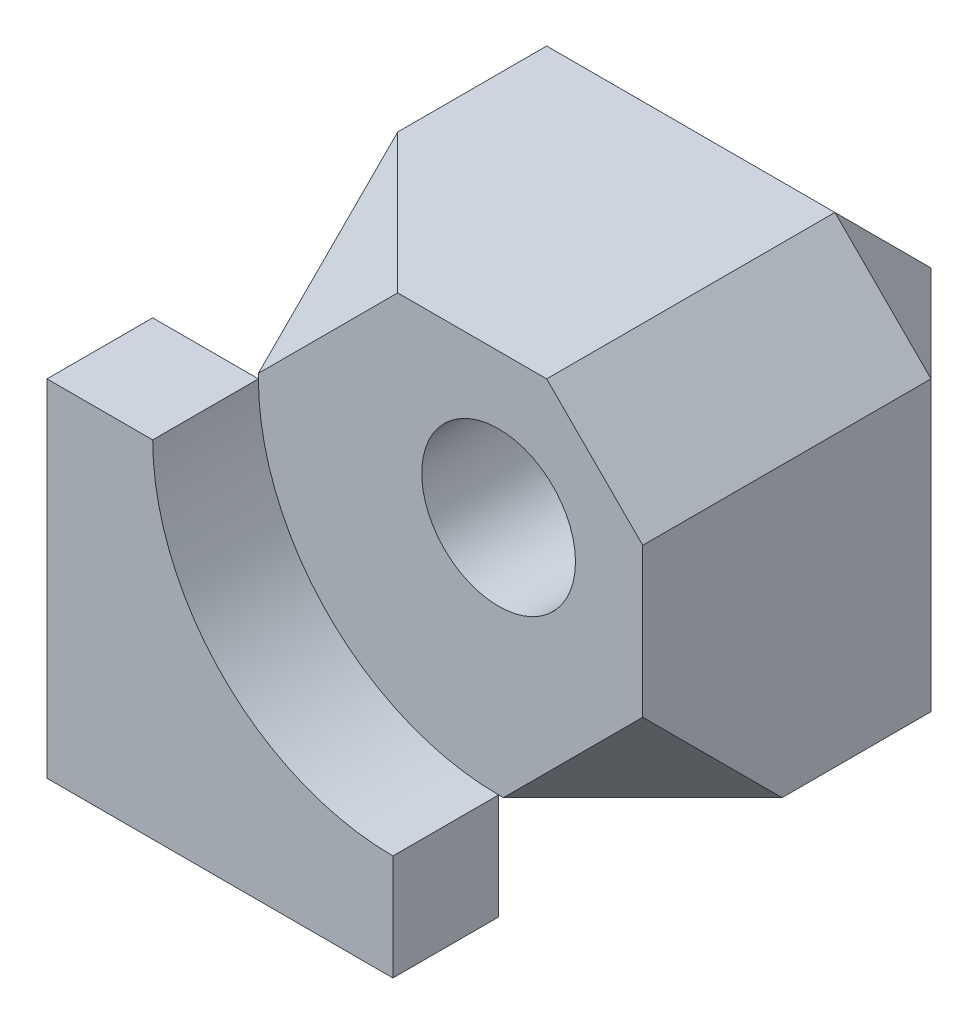
ISO-10303-21;
HEADER;
FILE_DESCRIPTION(('STEP AP214'),'2;1');
FILE_NAME('part.step','',(''),(''),'','','');
FILE_SCHEMA(('AUTOMOTIVE_DESIGN { 1 0 10303 214 1 1 1 1 }'));
ENDSEC;
DATA;
#1=APPLICATION_CONTEXT('core data for automotive mechanical design processes');
#2=APPLICATION_PROTOCOL_DEFINITION('international standard','automotive_design',2000,#1);
#3=PRODUCT_CONTEXT('',#1,'mechanical');
#4=PRODUCT('Part','Part','',(#3));
#5=PRODUCT_RELATED_PRODUCT_CATEGORY('part','',(#4));
#6=PRODUCT_DEFINITION_FORMATION('','',#4);
#7=PRODUCT_DEFINITION_CONTEXT('part definition',#1,'design');
#8=PRODUCT_DEFINITION('design','',#6,#7);
#9=PRODUCT_DEFINITION_SHAPE('','',#8);
#10=(LENGTH_UNIT() NAMED_UNIT(*) SI_UNIT(.MILLI.,.METRE.));
#11=(NAMED_UNIT(*) PLANE_ANGLE_UNIT() SI_UNIT($,.RADIAN.));
#12=(NAMED_UNIT(*) SI_UNIT($,.STERADIAN.) SOLID_ANGLE_UNIT());
#13=UNCERTAINTY_MEASURE_WITH_UNIT(LENGTH_MEASURE(1.E-05),#10,'distance_accuracy_value','');
#14=(GEOMETRIC_REPRESENTATION_CONTEXT(3) GLOBAL_UNCERTAINTY_ASSIGNED_CONTEXT((#13)) GLOBAL_UNIT_ASSIGNED_CONTEXT((#10,
#11,#12)) REPRESENTATION_CONTEXT('',''));
#15=CARTESIAN_POINT('',(0.,0.,0.));
#16=DIRECTION('',(0.,0.,1.));
#17=DIRECTION('',(1.,0.,0.));
#18=AXIS2_PLACEMENT_3D('',#15,#16,#17);
#19=CARTESIAN_POINT('',(0.,-2.50000000000001,7.5));
#20=DIRECTION('',(-1.,0.,0.));
#21=DIRECTION('',(0.,1.,0.));
#22=AXIS2_PLACEMENT_3D('',#19,#20,#21);
#23=PLANE('',#22);
#24=DIRECTION('',(0.,0.,1.));
#25=VECTOR('',#24,1.);
#26=CARTESIAN_POINT('',(0.,-2.20000000000001,7.5));
#27=LINE('',#26,#25);
#28=CARTESIAN_POINT('',(0.,-2.20000000000001,5.00000000000001));
#29=VERTEX_POINT('',#28);
#30=CARTESIAN_POINT('',(0.,-2.20000000000001,7.2));
#31=VERTEX_POINT('',#30);
#32=EDGE_CURVE('E66',#29,#31,#27,.T.);
#33=ORIENTED_EDGE('',*,*,#32,.F.);
#34=DIRECTION('',(0.,1.,0.));
#35=VECTOR('',#34,1.);
#36=CARTESIAN_POINT('',(0.,-2.5,5.00000000000001));
#37=LINE('',#36,#35);
#38=CARTESIAN_POINT('',(0.,0.,5.00000000000001));
#39=VERTEX_POINT('',#38);
#40=EDGE_CURVE('E238',#29,#39,#37,.T.);
#41=ORIENTED_EDGE('',*,*,#40,.T.);
#42=DIRECTION('',(0.,0.,-1.));
#43=VECTOR('',#42,1.);
#44=CARTESIAN_POINT('',(0.,0.,7.5));
#45=LINE('',#44,#43);
#46=CARTESIAN_POINT('',(0.,0.,7.2));
#47=VERTEX_POINT('',#46);
#48=EDGE_CURVE('E212',#47,#39,#45,.T.);
#49=ORIENTED_EDGE('',*,*,#48,.F.);
#50=DIRECTION('',(0.,1.,0.));
#51=VECTOR('',#50,1.);
#52=CARTESIAN_POINT('',(0.,-2.50000000000001,7.2));
#53=LINE('',#52,#51);
#54=EDGE_CURVE('E347',#31,#47,#53,.T.);
#55=ORIENTED_EDGE('',*,*,#54,.F.);
#56=EDGE_LOOP('',(#33,#41,#49,#55));
#57=FACE_BOUND('',#56,.T.);
#58=ADVANCED_FACE('F50',(#57),#23,.F.);
#59=CARTESIAN_POINT('',(-7.20000000000001,0.,0.));
#60=DIRECTION('',(-1.,0.,0.));
#61=DIRECTION('',(0.,-1.,0.));
#62=AXIS2_PLACEMENT_3D('',#59,#60,#61);
#63=PLANE('',#62);
#64=DIRECTION('',(0.,-1.,0.));
#65=VECTOR('',#64,1.);
#66=CARTESIAN_POINT('',(-7.20000000000001,-2.5,0.));
#67=LINE('',#66,#65);
#68=CARTESIAN_POINT('',(-7.20000000000001,0.,0.));
#69=VERTEX_POINT('',#68);
#70=CARTESIAN_POINT('',(-7.20000000000001,-2.20000000000001,0.));
#71=VERTEX_POINT('',#70);
#72=EDGE_CURVE('E165',#69,#71,#67,.T.);
#73=ORIENTED_EDGE('',*,*,#72,.T.);
#74=DIRECTION('',(0.,0.,1.));
#75=VECTOR('',#74,1.);
#76=CARTESIAN_POINT('',(-7.20000000000001,-2.20000000000001,0.));
#77=LINE('',#76,#75);
#78=CARTESIAN_POINT('',(-7.20000000000001,-2.20000000000001,7.2));
#79=VERTEX_POINT('',#78);
#80=EDGE_CURVE('E158',#71,#79,#77,.T.);
#81=ORIENTED_EDGE('',*,*,#80,.T.);
#82=DIRECTION('',(0.,1.,0.));
#83=VECTOR('',#82,1.);
#84=CARTESIAN_POINT('',(-7.20000000000001,0.,7.2));
#85=LINE('',#84,#83);
#86=CARTESIAN_POINT('',(-7.20000000000001,4.99999999999999,7.2));
#87=VERTEX_POINT('',#86);
#88=EDGE_CURVE('E59',#79,#87,#85,.T.);
#89=ORIENTED_EDGE('',*,*,#88,.T.);
#90=DIRECTION('',(0.,0.,-1.));
#91=VECTOR('',#90,1.);
#92=CARTESIAN_POINT('',(-7.20000000000001,4.99999999999999,7.5));
#93=LINE('',#92,#91);
#94=CARTESIAN_POINT('',(-7.20000000000001,5.,5.));
#95=VERTEX_POINT('',#94);
#96=EDGE_CURVE('E259',#87,#95,#93,.T.);
#97=ORIENTED_EDGE('',*,*,#96,.T.);
#98=CARTESIAN_POINT('',(-7.20000000000001,5.00000000000001,0.));
#99=DIRECTION('',(-1.,0.,0.));
#100=DIRECTION('',(0.,-1.,0.));
#101=AXIS2_PLACEMENT_3D('',#98,#99,#100);
#102=CIRCLE('',#101,5.00000000000001);
#103=EDGE_CURVE('E173',#95,#69,#102,.F.);
#104=ORIENTED_EDGE('',*,*,#103,.T.);
#105=EDGE_LOOP('',(#73,#81,#89,#97,#104));
#106=FACE_BOUND('',#105,.T.);
#107=ADVANCED_FACE('F163',(#106),#63,.T.);
#108=CARTESIAN_POINT('',(-7.5,-2.5,0.));
#109=DIRECTION('',(0.,0.,1.));
#110=DIRECTION('',(0.,-1.,0.));
#111=AXIS2_PLACEMENT_3D('',#108,#109,#110);
#112=PLANE('',#111);
#113=DIRECTION('',(1.,0.,0.));
#114=VECTOR('',#113,1.);
#115=CARTESIAN_POINT('',(-7.5,-2.20000000000001,0.));
#116=LINE('',#115,#114);
#117=CARTESIAN_POINT('',(-5.00000000000001,-2.20000000000001,0.));
#118=VERTEX_POINT('',#117);
#119=EDGE_CURVE('E355',#71,#118,#116,.T.);
#120=ORIENTED_EDGE('',*,*,#119,.F.);
#121=ORIENTED_EDGE('',*,*,#72,.F.);
#122=DIRECTION('',(1.,0.,0.));
#123=VECTOR('',#122,1.);
#124=CARTESIAN_POINT('',(-7.5,0.,0.));
#125=LINE('',#124,#123);
#126=CARTESIAN_POINT('',(-5.,0.,0.));
#127=VERTEX_POINT('',#126);
#128=EDGE_CURVE('E227',#69,#127,#125,.T.);
#129=ORIENTED_EDGE('',*,*,#128,.T.);
#130=DIRECTION('',(0.,-1.,0.));
#131=VECTOR('',#130,1.);
#132=CARTESIAN_POINT('',(-5.,-2.5,0.));
#133=LINE('',#132,#131);
#134=EDGE_CURVE('E234',#127,#118,#133,.T.);
#135=ORIENTED_EDGE('',*,*,#134,.T.);
#136=EDGE_LOOP('',(#120,#121,#129,#135));
#137=FACE_BOUND('',#136,.T.);
#138=ADVANCED_FACE('F423',(#137),#112,.F.);
#139=CARTESIAN_POINT('',(0.,-2.5,0.));
#140=DIRECTION('',(0.,1.,0.));
#141=DIRECTION('',(1.,0.,0.));
#142=AXIS2_PLACEMENT_3D('',#139,#140,#141);
#143=CYLINDRICAL_SURFACE('',#142,5.00000000000001);
#144=CARTESIAN_POINT('',(0.,-2.20000000000001,0.));
#145=DIRECTION('',(0.,-1.,0.));
#146=DIRECTION('',(1.,0.,0.));
#147=AXIS2_PLACEMENT_3D('',#144,#145,#146);
#148=CIRCLE('',#147,5.00000000000001);
#149=EDGE_CURVE('E358',#118,#29,#148,.F.);
#150=ORIENTED_EDGE('',*,*,#149,.F.);
#151=ORIENTED_EDGE('',*,*,#134,.F.);
#152=CARTESIAN_POINT('',(0.,0.,0.));
#153=DIRECTION('',(0.,1.,0.));
#154=DIRECTION('',(1.,0.,0.));
#155=AXIS2_PLACEMENT_3D('',#152,#153,#154);
#156=CIRCLE('',#155,5.00000000000001);
#157=EDGE_CURVE('E241',#127,#39,#156,.T.);
#158=ORIENTED_EDGE('',*,*,#157,.T.);
#159=ORIENTED_EDGE('',*,*,#40,.F.);
#160=EDGE_LOOP('',(#150,#151,#158,#159));
#161=FACE_BOUND('',#160,.T.);
#162=ADVANCED_FACE('F368',(#161),#143,.F.);
#163=CARTESIAN_POINT('',(0.,0.,7.2));
#164=DIRECTION('',(0.,0.,1.));
#165=DIRECTION('',(1.,0.,0.));
#166=AXIS2_PLACEMENT_3D('',#163,#164,#165);
#167=PLANE('',#166);
#168=ORIENTED_EDGE('',*,*,#88,.F.);
#169=DIRECTION('',(1.,0.,0.));
#170=VECTOR('',#169,1.);
#171=CARTESIAN_POINT('',(0.,-2.20000000000001,7.2));
#172=LINE('',#171,#170);
#173=EDGE_CURVE('E11',#79,#31,#172,.T.);
#174=ORIENTED_EDGE('',*,*,#173,.T.);
#175=ORIENTED_EDGE('',*,*,#54,.T.);
#176=CARTESIAN_POINT('',(0.,5.,7.2));
#177=DIRECTION('',(0.,0.,1.));
#178=DIRECTION('',(1.,0.,0.));
#179=AXIS2_PLACEMENT_3D('',#176,#177,#178);
#180=CIRCLE('',#179,5.00000000000001);
#181=CARTESIAN_POINT('',(-5.00000000000001,4.99999999999999,7.2));
#182=VERTEX_POINT('',#181);
#183=EDGE_CURVE('E350',#47,#182,#180,.F.);
#184=ORIENTED_EDGE('',*,*,#183,.T.);
#185=DIRECTION('',(-1.,0.,0.));
#186=VECTOR('',#185,1.);
#187=CARTESIAN_POINT('',(-7.50000000000001,4.99999999999999,7.2));
#188=LINE('',#187,#186);
#189=EDGE_CURVE('E170',#182,#87,#188,.T.);
#190=ORIENTED_EDGE('',*,*,#189,.T.);
#191=EDGE_LOOP('',(#168,#174,#175,#184,#190));
#192=FACE_BOUND('',#191,.T.);
#193=ADVANCED_FACE('F168',(#192),#167,.T.);
#194=CARTESIAN_POINT('',(-7.50000000000001,4.99999999999999,7.5));
#195=DIRECTION('',(0.,-1.,0.));
#196=DIRECTION('',(-1.,0.,0.));
#197=AXIS2_PLACEMENT_3D('',#194,#195,#196);
#198=PLANE('',#197);
#199=ORIENTED_EDGE('',*,*,#189,.F.);
#200=DIRECTION('',(0.,0.,-1.));
#201=VECTOR('',#200,1.);
#202=CARTESIAN_POINT('',(-5.00000000000001,4.99999999999999,7.5));
#203=LINE('',#202,#201);
#204=CARTESIAN_POINT('',(-5.00000000000001,4.99999999999999,5.));
#205=VERTEX_POINT('',#204);
#206=EDGE_CURVE('E216',#182,#205,#203,.T.);
#207=ORIENTED_EDGE('',*,*,#206,.T.);
#208=DIRECTION('',(1.,0.,0.));
#209=VECTOR('',#208,1.);
#210=CARTESIAN_POINT('',(-7.5,5.,5.));
#211=LINE('',#210,#209);
#212=EDGE_CURVE('E223',#95,#205,#211,.T.);
#213=ORIENTED_EDGE('',*,*,#212,.F.);
#214=ORIENTED_EDGE('',*,*,#96,.F.);
#215=EDGE_LOOP('',(#199,#207,#213,#214));
#216=FACE_BOUND('',#215,.T.);
#217=ADVANCED_FACE('F52',(#216),#198,.F.);
#218=CARTESIAN_POINT('',(0.,5.,7.5));
#219=DIRECTION('',(0.,0.,-1.));
#220=DIRECTION('',(0.,1.,0.));
#221=AXIS2_PLACEMENT_3D('',#218,#219,#220);
#222=CYLINDRICAL_SURFACE('',#221,5.00000000000001);
#223=ORIENTED_EDGE('',*,*,#183,.F.);
#224=ORIENTED_EDGE('',*,*,#48,.T.);
#225=CARTESIAN_POINT('',(0.,5.,5.));
#226=DIRECTION('',(0.,0.,-1.));
#227=DIRECTION('',(0.,1.,0.));
#228=AXIS2_PLACEMENT_3D('',#225,#226,#227);
#229=CIRCLE('',#228,5.00000000000001);
#230=EDGE_CURVE('E219',#39,#205,#229,.T.);
#231=ORIENTED_EDGE('',*,*,#230,.T.);
#232=ORIENTED_EDGE('',*,*,#206,.F.);
#233=EDGE_LOOP('',(#223,#224,#231,#232));
#234=FACE_BOUND('',#233,.T.);
#235=ADVANCED_FACE('F417',(#234),#222,.F.);
#236=CARTESIAN_POINT('',(-7.5,5.00000000000001,0.));
#237=DIRECTION('',(1.,0.,0.));
#238=DIRECTION('',(0.,0.,-1.));
#239=AXIS2_PLACEMENT_3D('',#236,#237,#238);
#240=CYLINDRICAL_SURFACE('',#239,5.00000000000001);
#241=ORIENTED_EDGE('',*,*,#103,.F.);
#242=ORIENTED_EDGE('',*,*,#212,.T.);
#243=CARTESIAN_POINT('',(-5.,5.00000000000001,0.));
#244=DIRECTION('',(1.,0.,0.));
#245=DIRECTION('',(0.,0.,-1.));
#246=AXIS2_PLACEMENT_3D('',#243,#244,#245);
#247=CIRCLE('',#246,5.00000000000001);
#248=EDGE_CURVE('E230',#205,#127,#247,.T.);
#249=ORIENTED_EDGE('',*,*,#248,.T.);
#250=ORIENTED_EDGE('',*,*,#128,.F.);
#251=EDGE_LOOP('',(#241,#242,#249,#250));
#252=FACE_BOUND('',#251,.T.);
#253=ADVANCED_FACE('F421',(#252),#240,.F.);
#254=CARTESIAN_POINT('',(0.,0.,0.));
#255=DIRECTION('',(0.,-1.,0.));
#256=DIRECTION('',(0.,0.,-1.));
#257=AXIS2_PLACEMENT_3D('',#254,#255,#256);
#258=PLANE('',#257);
#259=CARTESIAN_POINT('',(0.,0.,0.));
#260=DIRECTION('',(0.,-1.,0.));
#261=DIRECTION('',(0.,0.,-1.));
#262=AXIS2_PLACEMENT_3D('',#259,#260,#261);
#263=CIRCLE('',#262,1.6);
#264=CARTESIAN_POINT('',(0.,0.,-1.6));
#265=VERTEX_POINT('',#264);
#266=EDGE_CURVE('E309',#265,#265,#263,.T.);
#267=ORIENTED_EDGE('',*,*,#266,.F.);
#268=EDGE_LOOP('',(#267));
#269=FACE_BOUND('',#268,.T.);
#270=DIRECTION('',(0.,0.,1.));
#271=VECTOR('',#270,1.);
#272=CARTESIAN_POINT('',(-5.,0.,5.));
#273=LINE('',#272,#271);
#274=CARTESIAN_POINT('',(-5.,0.,-0.100000000000001));
#275=VERTEX_POINT('',#274);
#276=EDGE_CURVE('E296',#275,#127,#273,.T.);
#277=ORIENTED_EDGE('',*,*,#276,.F.);
#278=DIRECTION('',(0.707106781186548,0.,-0.707106781186548));
#279=VECTOR('',#278,1.);
#280=CARTESIAN_POINT('',(-2.55,0.,-2.55));
#281=LINE('',#280,#279);
#282=CARTESIAN_POINT('',(-2.10000000000001,0.,-3.));
#283=VERTEX_POINT('',#282);
#284=EDGE_CURVE('E185',#275,#283,#281,.T.);
#285=ORIENTED_EDGE('',*,*,#284,.T.);
#286=DIRECTION('',(-1.,0.,0.));
#287=VECTOR('',#286,1.);
#288=CARTESIAN_POINT('',(19.142135623731,0.,-3.));
#289=LINE('',#288,#287);
#290=CARTESIAN_POINT('',(0.999999999999994,0.,-3.));
#291=VERTEX_POINT('',#290);
#292=EDGE_CURVE('E325',#291,#283,#289,.T.);
#293=ORIENTED_EDGE('',*,*,#292,.F.);
#294=DIRECTION('',(-0.707106781186549,0.,-0.707106781186546));
#295=VECTOR('',#294,1.);
#296=CARTESIAN_POINT('',(2.,0.,-2.));
#297=LINE('',#296,#295);
#298=CARTESIAN_POINT('',(3.,0.,-1.));
#299=VERTEX_POINT('',#298);
#300=EDGE_CURVE('E262',#291,#299,#297,.F.);
#301=ORIENTED_EDGE('',*,*,#300,.T.);
#302=DIRECTION('',(0.,0.,1.));
#303=VECTOR('',#302,1.);
#304=CARTESIAN_POINT('',(3.,0.,-11.2462112512353));
#305=LINE('',#304,#303);
#306=CARTESIAN_POINT('',(3.,0.,2.1));
#307=VERTEX_POINT('',#306);
#308=EDGE_CURVE('E337',#299,#307,#305,.T.);
#309=ORIENTED_EDGE('',*,*,#308,.T.);
#310=DIRECTION('',(-0.707106781186547,0.,0.707106781186547));
#311=VECTOR('',#310,1.);
#312=CARTESIAN_POINT('',(2.55,0.,2.55));
#313=LINE('',#312,#311);
#314=CARTESIAN_POINT('',(0.100000000000001,0.,5.));
#315=VERTEX_POINT('',#314);
#316=EDGE_CURVE('E197',#307,#315,#313,.T.);
#317=ORIENTED_EDGE('',*,*,#316,.T.);
#318=DIRECTION('',(1.,0.,0.));
#319=VECTOR('',#318,1.);
#320=CARTESIAN_POINT('',(-5.,0.,5.));
#321=LINE('',#320,#319);
#322=EDGE_CURVE('E292',#39,#315,#321,.T.);
#323=ORIENTED_EDGE('',*,*,#322,.F.);
#324=ORIENTED_EDGE('',*,*,#157,.F.);
#325=EDGE_LOOP('',(#277,#285,#293,#301,#309,#317,#323,#324));
#326=FACE_BOUND('',#325,.T.);
#327=ADVANCED_FACE('F373',(#269,#326),#258,.T.);
#328=CARTESIAN_POINT('',(-5.,10.,5.));
#329=DIRECTION('',(1.,0.,0.));
#330=DIRECTION('',(0.,0.,-1.));
#331=AXIS2_PLACEMENT_3D('',#328,#329,#330);
#332=PLANE('',#331);
#333=DIRECTION('',(0.,0.707106781186548,-0.707106781186547));
#334=VECTOR('',#333,1.);
#335=CARTESIAN_POINT('',(-5.,2.45,-2.55));
#336=LINE('',#335,#334);
#337=CARTESIAN_POINT('',(-5.,2.89999999999999,-3.));
#338=VERTEX_POINT('',#337);
#339=EDGE_CURVE('E181',#275,#338,#336,.T.);
#340=ORIENTED_EDGE('',*,*,#339,.F.);
#341=ORIENTED_EDGE('',*,*,#276,.T.);
#342=ORIENTED_EDGE('',*,*,#248,.F.);
#343=DIRECTION('',(0.,-1.,0.));
#344=VECTOR('',#343,1.);
#345=CARTESIAN_POINT('',(-5.,10.,5.));
#346=LINE('',#345,#344);
#347=CARTESIAN_POINT('',(-5.,5.1,5.));
#348=VERTEX_POINT('',#347);
#349=EDGE_CURVE('E288',#348,#205,#346,.T.);
#350=ORIENTED_EDGE('',*,*,#349,.F.);
#351=DIRECTION('',(0.,-0.707106781186547,0.707106781186548));
#352=VECTOR('',#351,1.);
#353=CARTESIAN_POINT('',(-5.,7.55,2.55));
#354=LINE('',#353,#352);
#355=CARTESIAN_POINT('',(-5.,8.,2.09999999999999));
#356=VERTEX_POINT('',#355);
#357=EDGE_CURVE('E208',#356,#348,#354,.T.);
#358=ORIENTED_EDGE('',*,*,#357,.F.);
#359=DIRECTION('',(0.,0.,1.));
#360=VECTOR('',#359,1.);
#361=CARTESIAN_POINT('',(-5.,8.,5.));
#362=LINE('',#361,#360);
#363=CARTESIAN_POINT('',(-5.,8.,-0.999999999999993));
#364=VERTEX_POINT('',#363);
#365=EDGE_CURVE('E328',#364,#356,#362,.T.);
#366=ORIENTED_EDGE('',*,*,#365,.F.);
#367=DIRECTION('',(0.,0.707106781186546,0.707106781186549));
#368=VECTOR('',#367,1.);
#369=CARTESIAN_POINT('',(-5.,8.,-0.999999999999993));
#370=LINE('',#369,#368);
#371=CARTESIAN_POINT('',(-5.,6.,-3.));
#372=VERTEX_POINT('',#371);
#373=EDGE_CURVE('E277',#364,#372,#370,.F.);
#374=ORIENTED_EDGE('',*,*,#373,.T.);
#375=DIRECTION('',(0.,1.,0.));
#376=VECTOR('',#375,1.);
#377=CARTESIAN_POINT('',(-5.,8.,-3.));
#378=LINE('',#377,#376);
#379=EDGE_CURVE('E334',#338,#372,#378,.T.);
#380=ORIENTED_EDGE('',*,*,#379,.F.);
#381=EDGE_LOOP('',(#340,#341,#342,#350,#358,#366,#374,#380));
#382=FACE_BOUND('',#381,.T.);
#383=CARTESIAN_POINT('',(-5.,5.,0.));
#384=DIRECTION('',(1.,0.,0.));
#385=DIRECTION('',(0.,0.,-1.));
#386=AXIS2_PLACEMENT_3D('',#383,#384,#385);
#387=CIRCLE('',#386,1.6);
#388=CARTESIAN_POINT('',(-5.,5.,-1.6));
#389=VERTEX_POINT('',#388);
#390=EDGE_CURVE('E317',#389,#389,#387,.T.);
#391=ORIENTED_EDGE('',*,*,#390,.T.);
#392=EDGE_LOOP('',(#391));
#393=FACE_BOUND('',#392,.T.);
#394=ADVANCED_FACE('F410',(#382,#393),#332,.F.);
#395=CARTESIAN_POINT('',(-5.,10.,5.));
#396=DIRECTION('',(0.,0.,-1.));
#397=DIRECTION('',(-1.,0.,0.));
#398=AXIS2_PLACEMENT_3D('',#395,#396,#397);
#399=PLANE('',#398);
#400=DIRECTION('',(-0.707106781186547,-0.707106781186547,0.));
#401=VECTOR('',#400,1.);
#402=CARTESIAN_POINT('',(2.55,2.45,5.));
#403=LINE('',#402,#401);
#404=CARTESIAN_POINT('',(3.,2.9,5.));
#405=VERTEX_POINT('',#404);
#406=EDGE_CURVE('E193',#405,#315,#403,.T.);
#407=ORIENTED_EDGE('',*,*,#406,.F.);
#408=DIRECTION('',(0.,-1.,0.));
#409=VECTOR('',#408,1.);
#410=CARTESIAN_POINT('',(3.,8.,5.));
#411=LINE('',#410,#409);
#412=CARTESIAN_POINT('',(3.,6.,5.));
#413=VERTEX_POINT('',#412);
#414=EDGE_CURVE('E250',#413,#405,#411,.T.);
#415=ORIENTED_EDGE('',*,*,#414,.F.);
#416=DIRECTION('',(0.707106781186549,-0.707106781186546,0.));
#417=VECTOR('',#416,1.);
#418=CARTESIAN_POINT('',(3.,6.,5.));
#419=LINE('',#418,#417);
#420=CARTESIAN_POINT('',(0.999999999999994,8.,5.));
#421=VERTEX_POINT('',#420);
#422=EDGE_CURVE('E245',#413,#421,#419,.F.);
#423=ORIENTED_EDGE('',*,*,#422,.T.);
#424=DIRECTION('',(-1.,0.,0.));
#425=VECTOR('',#424,1.);
#426=CARTESIAN_POINT('',(19.142135623731,8.,5.));
#427=LINE('',#426,#425);
#428=CARTESIAN_POINT('',(-2.09999999999999,8.,5.));
#429=VERTEX_POINT('',#428);
#430=EDGE_CURVE('E321',#421,#429,#427,.T.);
#431=ORIENTED_EDGE('',*,*,#430,.T.);
#432=DIRECTION('',(0.707106781186548,0.707106781186547,0.));
#433=VECTOR('',#432,1.);
#434=CARTESIAN_POINT('',(-2.55,7.55,5.));
#435=LINE('',#434,#433);
#436=EDGE_CURVE('E204',#348,#429,#435,.T.);
#437=ORIENTED_EDGE('',*,*,#436,.F.);
#438=ORIENTED_EDGE('',*,*,#349,.T.);
#439=ORIENTED_EDGE('',*,*,#230,.F.);
#440=ORIENTED_EDGE('',*,*,#322,.T.);
#441=EDGE_LOOP('',(#407,#415,#423,#431,#437,#438,#439,#440));
#442=FACE_BOUND('',#441,.T.);
#443=CARTESIAN_POINT('',(0.,5.,5.));
#444=DIRECTION('',(0.,0.,1.));
#445=DIRECTION('',(1.,0.,0.));
#446=AXIS2_PLACEMENT_3D('',#443,#444,#445);
#447=CIRCLE('',#446,1.6);
#448=CARTESIAN_POINT('',(1.6,5.,5.));
#449=VERTEX_POINT('',#448);
#450=EDGE_CURVE('E301',#449,#449,#447,.T.);
#451=ORIENTED_EDGE('',*,*,#450,.F.);
#452=EDGE_LOOP('',(#451));
#453=FACE_BOUND('',#452,.T.);
#454=ADVANCED_FACE('F378',(#442,#453),#399,.F.);
#455=CARTESIAN_POINT('',(0.,5.,1.8));
#456=DIRECTION('',(0.,0.,1.));
#457=DIRECTION('',(1.,0.,0.));
#458=AXIS2_PLACEMENT_3D('',#455,#456,#457);
#459=CYLINDRICAL_SURFACE('',#458,1.6);
#460=CARTESIAN_POINT('',(0.,5.,1.8));
#461=DIRECTION('',(0.,0.,1.));
#462=DIRECTION('',(1.,0.,0.));
#463=AXIS2_PLACEMENT_3D('',#460,#461,#462);
#464=CIRCLE('',#463,1.6);
#465=CARTESIAN_POINT('',(1.6,5.,1.8));
#466=VERTEX_POINT('',#465);
#467=EDGE_CURVE('E300',#466,#466,#464,.T.);
#468=ORIENTED_EDGE('',*,*,#467,.F.);
#469=EDGE_LOOP('',(#468));
#470=FACE_BOUND('',#469,.T.);
#471=ORIENTED_EDGE('',*,*,#450,.T.);
#472=EDGE_LOOP('',(#471));
#473=FACE_BOUND('',#472,.T.);
#474=ADVANCED_FACE('F487',(#470,#473),#459,.F.);
#475=CARTESIAN_POINT('',(0.,5.,1.8));
#476=DIRECTION('',(0.,0.,1.));
#477=DIRECTION('',(1.,0.,0.));
#478=AXIS2_PLACEMENT_3D('',#475,#476,#477);
#479=PLANE('',#478);
#480=ORIENTED_EDGE('',*,*,#467,.T.);
#481=EDGE_LOOP('',(#480));
#482=FACE_BOUND('',#481,.T.);
#483=ADVANCED_FACE('F483',(#482),#479,.T.);
#484=CARTESIAN_POINT('',(0.,3.2,0.));
#485=DIRECTION('',(0.,-1.,0.));
#486=DIRECTION('',(0.,0.,-1.));
#487=AXIS2_PLACEMENT_3D('',#484,#485,#486);
#488=CYLINDRICAL_SURFACE('',#487,1.6);
#489=CARTESIAN_POINT('',(0.,3.2,0.));
#490=DIRECTION('',(0.,-1.,0.));
#491=DIRECTION('',(0.,0.,-1.));
#492=AXIS2_PLACEMENT_3D('',#489,#490,#491);
#493=CIRCLE('',#492,1.6);
#494=CARTESIAN_POINT('',(0.,3.2,-1.6));
#495=VERTEX_POINT('',#494);
#496=EDGE_CURVE('E305',#495,#495,#493,.T.);
#497=ORIENTED_EDGE('',*,*,#496,.F.);
#498=EDGE_LOOP('',(#497));
#499=FACE_BOUND('',#498,.T.);
#500=ORIENTED_EDGE('',*,*,#266,.T.);
#501=EDGE_LOOP('',(#500));
#502=FACE_BOUND('',#501,.T.);
#503=ADVANCED_FACE('F479',(#499,#502),#488,.F.);
#504=CARTESIAN_POINT('',(0.,3.2,0.));
#505=DIRECTION('',(0.,-1.,0.));
#506=DIRECTION('',(0.,0.,-1.));
#507=AXIS2_PLACEMENT_3D('',#504,#505,#506);
#508=PLANE('',#507);
#509=ORIENTED_EDGE('',*,*,#496,.T.);
#510=EDGE_LOOP('',(#509));
#511=FACE_BOUND('',#510,.T.);
#512=ADVANCED_FACE('F475',(#511),#508,.T.);
#513=CARTESIAN_POINT('',(-1.8,5.,0.));
#514=DIRECTION('',(-1.,0.,0.));
#515=DIRECTION('',(0.,0.,1.));
#516=AXIS2_PLACEMENT_3D('',#513,#514,#515);
#517=CYLINDRICAL_SURFACE('',#516,1.6);
#518=CARTESIAN_POINT('',(-1.8,5.,0.));
#519=DIRECTION('',(1.,0.,0.));
#520=DIRECTION('',(0.,0.,-1.));
#521=AXIS2_PLACEMENT_3D('',#518,#519,#520);
#522=CIRCLE('',#521,1.6);
#523=CARTESIAN_POINT('',(-1.8,5.,-1.6));
#524=VERTEX_POINT('',#523);
#525=EDGE_CURVE('E313',#524,#524,#522,.T.);
#526=ORIENTED_EDGE('',*,*,#525,.T.);
#527=EDGE_LOOP('',(#526));
#528=FACE_BOUND('',#527,.T.);
#529=ORIENTED_EDGE('',*,*,#390,.F.);
#530=EDGE_LOOP('',(#529));
#531=FACE_BOUND('',#530,.T.);
#532=ADVANCED_FACE('F471',(#528,#531),#517,.F.);
#533=CARTESIAN_POINT('',(-1.8,5.,0.));
#534=DIRECTION('',(1.,0.,0.));
#535=DIRECTION('',(0.,0.,-1.));
#536=AXIS2_PLACEMENT_3D('',#533,#534,#535);
#537=PLANE('',#536);
#538=ORIENTED_EDGE('',*,*,#525,.F.);
#539=EDGE_LOOP('',(#538));
#540=FACE_BOUND('',#539,.T.);
#541=ADVANCED_FACE('F465',(#540),#537,.F.);
#542=CARTESIAN_POINT('',(19.142135623731,8.,5.));
#543=DIRECTION('',(0.,-1.,0.));
#544=DIRECTION('',(0.,0.,-1.));
#545=AXIS2_PLACEMENT_3D('',#542,#543,#544);
#546=PLANE('',#545);
#547=DIRECTION('',(-0.707106781186548,0.,-0.707106781186547));
#548=VECTOR('',#547,1.);
#549=CARTESIAN_POINT('',(8.52106781186548,8.,15.6210678118655));
#550=LINE('',#549,#548);
#551=EDGE_CURVE('E200',#429,#356,#550,.T.);
#552=ORIENTED_EDGE('',*,*,#551,.F.);
#553=ORIENTED_EDGE('',*,*,#430,.F.);
#554=DIRECTION('',(0.,0.,-1.));
#555=VECTOR('',#554,1.);
#556=CARTESIAN_POINT('',(0.999999999999994,8.,5.));
#557=LINE('',#556,#555);
#558=CARTESIAN_POINT('',(0.999999999999994,8.,-0.999999999999993));
#559=VERTEX_POINT('',#558);
#560=EDGE_CURVE('E285',#421,#559,#557,.T.);
#561=ORIENTED_EDGE('',*,*,#560,.T.);
#562=DIRECTION('',(-1.,0.,0.));
#563=VECTOR('',#562,1.);
#564=CARTESIAN_POINT('',(19.142135623731,8.,-0.999999999999993));
#565=LINE('',#564,#563);
#566=EDGE_CURVE('E281',#559,#364,#565,.T.);
#567=ORIENTED_EDGE('',*,*,#566,.T.);
#568=ORIENTED_EDGE('',*,*,#365,.T.);
#569=EDGE_LOOP('',(#552,#553,#561,#567,#568));
#570=FACE_BOUND('',#569,.T.);
#571=ADVANCED_FACE('F402',(#570),#546,.F.);
#572=CARTESIAN_POINT('',(19.142135623731,8.,-3.));
#573=DIRECTION('',(0.,0.,1.));
#574=DIRECTION('',(1.,0.,0.));
#575=AXIS2_PLACEMENT_3D('',#572,#573,#574);
#576=PLANE('',#575);
#577=DIRECTION('',(0.707106781186547,-0.707106781186548,0.));
#578=VECTOR('',#577,1.);
#579=CARTESIAN_POINT('',(4.52106781186547,-6.62106781186548,-3.));
#580=LINE('',#579,#578);
#581=EDGE_CURVE('E175',#338,#283,#580,.T.);
#582=ORIENTED_EDGE('',*,*,#581,.F.);
#583=ORIENTED_EDGE('',*,*,#379,.T.);
#584=DIRECTION('',(1.,0.,0.));
#585=VECTOR('',#584,1.);
#586=CARTESIAN_POINT('',(19.142135623731,6.,-3.));
#587=LINE('',#586,#585);
#588=CARTESIAN_POINT('',(0.999999999999994,6.,-3.));
#589=VERTEX_POINT('',#588);
#590=EDGE_CURVE('E271',#372,#589,#587,.T.);
#591=ORIENTED_EDGE('',*,*,#590,.T.);
#592=DIRECTION('',(0.,-1.,0.));
#593=VECTOR('',#592,1.);
#594=CARTESIAN_POINT('',(0.999999999999994,8.,-3.));
#595=LINE('',#594,#593);
#596=EDGE_CURVE('E274',#589,#291,#595,.T.);
#597=ORIENTED_EDGE('',*,*,#596,.T.);
#598=ORIENTED_EDGE('',*,*,#292,.T.);
#599=EDGE_LOOP('',(#582,#583,#591,#597,#598));
#600=FACE_BOUND('',#599,.T.);
#601=ADVANCED_FACE('F462',(#600),#576,.F.);
#602=CARTESIAN_POINT('',(3.,8.,-11.2462112512353));
#603=DIRECTION('',(-1.,0.,0.));
#604=DIRECTION('',(0.,-1.,0.));
#605=AXIS2_PLACEMENT_3D('',#602,#603,#604);
#606=PLANE('',#605);
#607=DIRECTION('',(0.,0.707106781186547,0.707106781186548));
#608=VECTOR('',#607,1.);
#609=CARTESIAN_POINT('',(3.,-2.67310562561766,-0.573105625617661));
#610=LINE('',#609,#608);
#611=EDGE_CURVE('E189',#307,#405,#610,.T.);
#612=ORIENTED_EDGE('',*,*,#611,.F.);
#613=ORIENTED_EDGE('',*,*,#308,.F.);
#614=DIRECTION('',(0.,1.,0.));
#615=VECTOR('',#614,1.);
#616=CARTESIAN_POINT('',(3.,8.,-1.));
#617=LINE('',#616,#615);
#618=CARTESIAN_POINT('',(3.,6.,-1.));
#619=VERTEX_POINT('',#618);
#620=EDGE_CURVE('E265',#299,#619,#617,.T.);
#621=ORIENTED_EDGE('',*,*,#620,.T.);
#622=DIRECTION('',(0.,0.,1.));
#623=VECTOR('',#622,1.);
#624=CARTESIAN_POINT('',(3.,6.,-11.2462112512353));
#625=LINE('',#624,#623);
#626=EDGE_CURVE('E268',#619,#413,#625,.T.);
#627=ORIENTED_EDGE('',*,*,#626,.T.);
#628=ORIENTED_EDGE('',*,*,#414,.T.);
#629=EDGE_LOOP('',(#612,#613,#621,#627,#628));
#630=FACE_BOUND('',#629,.T.);
#631=ADVANCED_FACE('F385',(#630),#606,.F.);
#632=CARTESIAN_POINT('',(3.,8.,-1.));
#633=DIRECTION('',(-0.707106781186546,0.,0.707106781186549));
#634=DIRECTION('',(0.,1.,0.));
#635=AXIS2_PLACEMENT_3D('',#632,#633,#634);
#636=PLANE('',#635);
#637=ORIENTED_EDGE('',*,*,#300,.F.);
#638=ORIENTED_EDGE('',*,*,#596,.F.);
#639=DIRECTION('',(0.707106781186549,0.,0.707106781186546));
#640=VECTOR('',#639,1.);
#641=CARTESIAN_POINT('',(0.999999999999994,6.,-3.));
#642=LINE('',#641,#640);
#643=EDGE_CURVE('E246',#619,#589,#642,.F.);
#644=ORIENTED_EDGE('',*,*,#643,.F.);
#645=ORIENTED_EDGE('',*,*,#620,.F.);
#646=EDGE_LOOP('',(#637,#638,#644,#645));
#647=FACE_BOUND('',#646,.T.);
#648=ADVANCED_FACE('F391',(#647),#636,.F.);
#649=CARTESIAN_POINT('',(3.,6.,-11.2462112512353));
#650=DIRECTION('',(-0.707106781186546,-0.707106781186549,0.));
#651=DIRECTION('',(0.,0.,1.));
#652=AXIS2_PLACEMENT_3D('',#649,#650,#651);
#653=PLANE('',#652);
#654=ORIENTED_EDGE('',*,*,#422,.F.);
#655=ORIENTED_EDGE('',*,*,#626,.F.);
#656=DIRECTION('',(-0.707106781186549,0.707106781186546,0.));
#657=VECTOR('',#656,1.);
#658=CARTESIAN_POINT('',(2.,7.,-0.999999999999997));
#659=LINE('',#658,#657);
#660=EDGE_CURVE('E251',#559,#619,#659,.F.);
#661=ORIENTED_EDGE('',*,*,#660,.F.);
#662=ORIENTED_EDGE('',*,*,#560,.F.);
#663=EDGE_LOOP('',(#654,#655,#661,#662));
#664=FACE_BOUND('',#663,.T.);
#665=ADVANCED_FACE('F397',(#664),#653,.F.);
#666=CARTESIAN_POINT('',(0.999999999999994,6.,-3.));
#667=DIRECTION('',(0.577350269189624,0.577350269189628,-0.577350269189626));
#668=DIRECTION('',(0.,0.707106781186546,0.707106781186549));
#669=AXIS2_PLACEMENT_3D('',#666,#667,#668);
#670=PLANE('',#669);
#671=ORIENTED_EDGE('',*,*,#660,.T.);
#672=ORIENTED_EDGE('',*,*,#643,.T.);
#673=DIRECTION('',(0.,-0.707106781186546,-0.707106781186549));
#674=VECTOR('',#673,1.);
#675=CARTESIAN_POINT('',(0.999999999999994,6.,-3.));
#676=LINE('',#675,#674);
#677=EDGE_CURVE('E255',#559,#589,#676,.T.);
#678=ORIENTED_EDGE('',*,*,#677,.F.);
#679=EDGE_LOOP('',(#671,#672,#678));
#680=FACE_BOUND('',#679,.T.);
#681=ADVANCED_FACE('F505',(#680),#670,.T.);
#682=CARTESIAN_POINT('',(19.142135623731,8.,-0.999999999999993));
#683=DIRECTION('',(0.,-0.707106781186549,0.707106781186546));
#684=DIRECTION('',(-1.,0.,0.));
#685=AXIS2_PLACEMENT_3D('',#682,#683,#684);
#686=PLANE('',#685);
#687=ORIENTED_EDGE('',*,*,#677,.T.);
#688=ORIENTED_EDGE('',*,*,#590,.F.);
#689=ORIENTED_EDGE('',*,*,#373,.F.);
#690=ORIENTED_EDGE('',*,*,#566,.F.);
#691=EDGE_LOOP('',(#687,#688,#689,#690));
#692=FACE_BOUND('',#691,.T.);
#693=ADVANCED_FACE('F459',(#692),#686,.F.);
#694=CARTESIAN_POINT('',(-5.03333333333333,5.03333333333333,5.03333333333333));
#695=DIRECTION('',(-0.577350269189626,0.577350269189626,0.577350269189626));
#696=DIRECTION('',(0.,-0.707106781186547,0.707106781186548));
#697=AXIS2_PLACEMENT_3D('',#694,#695,#696);
#698=PLANE('',#697);
#699=ORIENTED_EDGE('',*,*,#551,.T.);
#700=ORIENTED_EDGE('',*,*,#357,.T.);
#701=ORIENTED_EDGE('',*,*,#436,.T.);
#702=EDGE_LOOP('',(#699,#700,#701));
#703=FACE_BOUND('',#702,.T.);
#704=ADVANCED_FACE('F406',(#703),#698,.T.);
#705=CARTESIAN_POINT('',(1.7,-1.7,1.7));
#706=DIRECTION('',(0.577350269189626,-0.577350269189626,0.577350269189626));
#707=DIRECTION('',(0.707106781186547,0.,-0.707106781186547));
#708=AXIS2_PLACEMENT_3D('',#705,#706,#707);
#709=PLANE('',#708);
#710=ORIENTED_EDGE('',*,*,#316,.F.);
#711=ORIENTED_EDGE('',*,*,#611,.T.);
#712=ORIENTED_EDGE('',*,*,#406,.T.);
#713=EDGE_LOOP('',(#710,#711,#712));
#714=FACE_BOUND('',#713,.T.);
#715=ADVANCED_FACE('F382',(#714),#709,.T.);
#716=CARTESIAN_POINT('',(-1.7,-1.7,-1.7));
#717=DIRECTION('',(-0.577350269189626,-0.577350269189626,-0.577350269189626));
#718=DIRECTION('',(-0.707106781186548,0.,0.707106781186548));
#719=AXIS2_PLACEMENT_3D('',#716,#717,#718);
#720=PLANE('',#719);
#721=ORIENTED_EDGE('',*,*,#284,.F.);
#722=ORIENTED_EDGE('',*,*,#339,.T.);
#723=ORIENTED_EDGE('',*,*,#581,.T.);
#724=EDGE_LOOP('',(#721,#722,#723));
#725=FACE_BOUND('',#724,.T.);
#726=ADVANCED_FACE('F451',(#725),#720,.T.);
#727=CARTESIAN_POINT('',(0.,-2.20000000000001,0.));
#728=DIRECTION('',(0.,-1.,0.));
#729=DIRECTION('',(1.,0.,0.));
#730=AXIS2_PLACEMENT_3D('',#727,#728,#729);
#731=PLANE('',#730);
#732=ORIENTED_EDGE('',*,*,#119,.T.);
#733=ORIENTED_EDGE('',*,*,#149,.T.);
#734=ORIENTED_EDGE('',*,*,#32,.T.);
#735=ORIENTED_EDGE('',*,*,#173,.F.);
#736=ORIENTED_EDGE('',*,*,#80,.F.);
#737=EDGE_LOOP('',(#732,#733,#734,#735,#736));
#738=FACE_BOUND('',#737,.T.);
#739=ADVANCED_FACE('F157',(#738),#731,.T.);
#740=CLOSED_SHELL('',(#58,#107,#138,#162,#193,#217,#235,#253,#327,#394,#454,#474,#483,#503,#512,
#532,#541,#571,#601,#631,#648,#665,#681,#693,#704,#715,#726,#739));
#741=MANIFOLD_SOLID_BREP('B2',#740);
#742=ADVANCED_BREP_SHAPE_REPRESENTATION('',(#18,#741),#14);
#743=SHAPE_DEFINITION_REPRESENTATION(#9,#742);
ENDSEC;
END-ISO-10303-21;
